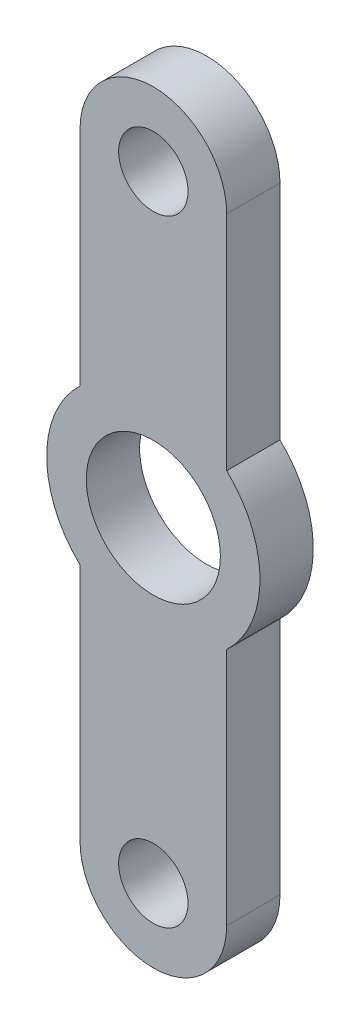
ISO-10303-21;
HEADER;
FILE_DESCRIPTION(('STEP AP214'),'2;1');
FILE_NAME('part.step','',(''),(''),'','','');
FILE_SCHEMA(('AUTOMOTIVE_DESIGN { 1 0 10303 214 1 1 1 1 }'));
ENDSEC;
DATA;
#1=APPLICATION_CONTEXT('core data for automotive mechanical design processes');
#2=APPLICATION_PROTOCOL_DEFINITION('international standard','automotive_design',2000,#1);
#3=PRODUCT_CONTEXT('',#1,'mechanical');
#4=PRODUCT('Part','Part','',(#3));
#5=PRODUCT_RELATED_PRODUCT_CATEGORY('part','',(#4));
#6=PRODUCT_DEFINITION_FORMATION('','',#4);
#7=PRODUCT_DEFINITION_CONTEXT('part definition',#1,'design');
#8=PRODUCT_DEFINITION('design','',#6,#7);
#9=PRODUCT_DEFINITION_SHAPE('','',#8);
#10=(LENGTH_UNIT() NAMED_UNIT(*) SI_UNIT(.MILLI.,.METRE.));
#11=(NAMED_UNIT(*) PLANE_ANGLE_UNIT() SI_UNIT($,.RADIAN.));
#12=(NAMED_UNIT(*) SI_UNIT($,.STERADIAN.) SOLID_ANGLE_UNIT());
#13=UNCERTAINTY_MEASURE_WITH_UNIT(LENGTH_MEASURE(1.E-05),#10,'distance_accuracy_value','');
#14=(GEOMETRIC_REPRESENTATION_CONTEXT(3) GLOBAL_UNCERTAINTY_ASSIGNED_CONTEXT((#13)) GLOBAL_UNIT_ASSIGNED_CONTEXT((#10,
#11,#12)) REPRESENTATION_CONTEXT('',''));
#15=CARTESIAN_POINT('',(0.,0.,0.));
#16=DIRECTION('',(0.,0.,1.));
#17=DIRECTION('',(1.,0.,0.));
#18=AXIS2_PLACEMENT_3D('',#15,#16,#17);
#19=CARTESIAN_POINT('',(0.,22.5,4.));
#20=DIRECTION('',(0.,0.,-1.));
#21=DIRECTION('',(-1.,0.,0.));
#22=AXIS2_PLACEMENT_3D('',#19,#20,#21);
#23=PLANE('',#22);
#24=CARTESIAN_POINT('',(0.,22.5,4.));
#25=DIRECTION('',(0.,0.,1.));
#26=DIRECTION('',(-1.,0.,0.));
#27=AXIS2_PLACEMENT_3D('',#24,#25,#26);
#28=CIRCLE('',#27,5.5);
#29=CARTESIAN_POINT('',(5.5,22.5,4.));
#30=VERTEX_POINT('',#29);
#31=CARTESIAN_POINT('',(-5.5,22.5,4.));
#32=VERTEX_POINT('',#31);
#33=EDGE_CURVE('E164',#30,#32,#28,.T.);
#34=ORIENTED_EDGE('',*,*,#33,.T.);
#35=DIRECTION('',(0.,-1.,0.));
#36=VECTOR('',#35,1.);
#37=CARTESIAN_POINT('',(-5.5,22.5,4.));
#38=LINE('',#37,#36);
#39=CARTESIAN_POINT('',(-5.5,5.80947501931113,4.));
#40=VERTEX_POINT('',#39);
#41=EDGE_CURVE('E100',#32,#40,#38,.T.);
#42=ORIENTED_EDGE('',*,*,#41,.T.);
#43=CARTESIAN_POINT('',(0.,0.,4.));
#44=DIRECTION('',(0.,0.,1.));
#45=DIRECTION('',(-1.,0.,0.));
#46=AXIS2_PLACEMENT_3D('',#43,#44,#45);
#47=CIRCLE('',#46,8.00000000000001);
#48=CARTESIAN_POINT('',(-5.5,-5.80947501931112,4.));
#49=VERTEX_POINT('',#48);
#50=EDGE_CURVE('E185',#40,#49,#47,.T.);
#51=ORIENTED_EDGE('',*,*,#50,.T.);
#52=DIRECTION('',(0.,-1.,0.));
#53=VECTOR('',#52,1.);
#54=CARTESIAN_POINT('',(-5.5,-23.75,4.));
#55=LINE('',#54,#53);
#56=CARTESIAN_POINT('',(-5.5,-23.75,4.));
#57=VERTEX_POINT('',#56);
#58=EDGE_CURVE('E199',#49,#57,#55,.T.);
#59=ORIENTED_EDGE('',*,*,#58,.T.);
#60=CARTESIAN_POINT('',(0.,-23.75,4.));
#61=DIRECTION('',(0.,0.,1.));
#62=DIRECTION('',(1.,0.,0.));
#63=AXIS2_PLACEMENT_3D('',#60,#61,#62);
#64=CIRCLE('',#63,5.5);
#65=CARTESIAN_POINT('',(5.5,-23.75,4.));
#66=VERTEX_POINT('',#65);
#67=EDGE_CURVE('E119',#57,#66,#64,.T.);
#68=ORIENTED_EDGE('',*,*,#67,.T.);
#69=DIRECTION('',(0.,1.,0.));
#70=VECTOR('',#69,1.);
#71=CARTESIAN_POINT('',(5.5,-23.75,4.));
#72=LINE('',#71,#70);
#73=CARTESIAN_POINT('',(5.5,-5.80947501931113,4.));
#74=VERTEX_POINT('',#73);
#75=EDGE_CURVE('E113',#66,#74,#72,.T.);
#76=ORIENTED_EDGE('',*,*,#75,.T.);
#77=CARTESIAN_POINT('',(0.,0.,4.));
#78=DIRECTION('',(0.,0.,1.));
#79=DIRECTION('',(-1.,0.,0.));
#80=AXIS2_PLACEMENT_3D('',#77,#78,#79);
#81=CIRCLE('',#80,8.);
#82=CARTESIAN_POINT('',(5.5,5.80947501931112,4.));
#83=VERTEX_POINT('',#82);
#84=EDGE_CURVE('E117',#74,#83,#81,.T.);
#85=ORIENTED_EDGE('',*,*,#84,.T.);
#86=DIRECTION('',(0.,1.,0.));
#87=VECTOR('',#86,1.);
#88=CARTESIAN_POINT('',(5.5,22.5,4.));
#89=LINE('',#88,#87);
#90=EDGE_CURVE('E57',#83,#30,#89,.T.);
#91=ORIENTED_EDGE('',*,*,#90,.T.);
#92=EDGE_LOOP('',(#34,#42,#51,#59,#68,#76,#85,#91));
#93=FACE_BOUND('',#92,.T.);
#94=CARTESIAN_POINT('',(0.,22.5,4.));
#95=DIRECTION('',(0.,0.,1.));
#96=DIRECTION('',(1.,0.,0.));
#97=AXIS2_PLACEMENT_3D('',#94,#95,#96);
#98=CIRCLE('',#97,2.6);
#99=CARTESIAN_POINT('',(2.6,22.5,4.));
#100=VERTEX_POINT('',#99);
#101=EDGE_CURVE('E146',#100,#100,#98,.T.);
#102=ORIENTED_EDGE('',*,*,#101,.F.);
#103=EDGE_LOOP('',(#102));
#104=FACE_BOUND('',#103,.T.);
#105=CARTESIAN_POINT('',(0.,-23.75,4.));
#106=DIRECTION('',(0.,0.,1.));
#107=DIRECTION('',(1.,0.,0.));
#108=AXIS2_PLACEMENT_3D('',#105,#106,#107);
#109=CIRCLE('',#108,2.6);
#110=CARTESIAN_POINT('',(2.6,-23.75,4.));
#111=VERTEX_POINT('',#110);
#112=EDGE_CURVE('E213',#111,#111,#109,.T.);
#113=ORIENTED_EDGE('',*,*,#112,.F.);
#114=EDGE_LOOP('',(#113));
#115=FACE_BOUND('',#114,.T.);
#116=CARTESIAN_POINT('',(0.,0.,4.));
#117=DIRECTION('',(0.,0.,1.));
#118=DIRECTION('',(1.,0.,0.));
#119=AXIS2_PLACEMENT_3D('',#116,#117,#118);
#120=CIRCLE('',#119,5.03);
#121=CARTESIAN_POINT('',(5.03,0.,4.));
#122=VERTEX_POINT('',#121);
#123=EDGE_CURVE('E221',#122,#122,#120,.T.);
#124=ORIENTED_EDGE('',*,*,#123,.F.);
#125=EDGE_LOOP('',(#124));
#126=FACE_BOUND('',#125,.T.);
#127=ADVANCED_FACE('F39',(#93,#104,#115,#126),#23,.F.);
#128=CARTESIAN_POINT('',(0.,22.5,0.));
#129=DIRECTION('',(0.,0.,-1.));
#130=DIRECTION('',(-1.,0.,0.));
#131=AXIS2_PLACEMENT_3D('',#128,#129,#130);
#132=PLANE('',#131);
#133=CARTESIAN_POINT('',(0.,-23.75,0.));
#134=DIRECTION('',(0.,0.,1.));
#135=DIRECTION('',(1.,0.,0.));
#136=AXIS2_PLACEMENT_3D('',#133,#134,#135);
#137=CIRCLE('',#136,2.6);
#138=CARTESIAN_POINT('',(2.6,-23.75,0.));
#139=VERTEX_POINT('',#138);
#140=EDGE_CURVE('E217',#139,#139,#137,.T.);
#141=ORIENTED_EDGE('',*,*,#140,.T.);
#142=EDGE_LOOP('',(#141));
#143=FACE_BOUND('',#142,.T.);
#144=CARTESIAN_POINT('',(0.,22.5,0.));
#145=DIRECTION('',(0.,0.,1.));
#146=DIRECTION('',(-1.,0.,0.));
#147=AXIS2_PLACEMENT_3D('',#144,#145,#146);
#148=CIRCLE('',#147,5.5);
#149=CARTESIAN_POINT('',(5.5,22.5,0.));
#150=VERTEX_POINT('',#149);
#151=CARTESIAN_POINT('',(-5.5,22.5,0.));
#152=VERTEX_POINT('',#151);
#153=EDGE_CURVE('E141',#150,#152,#148,.T.);
#154=ORIENTED_EDGE('',*,*,#153,.F.);
#155=DIRECTION('',(0.,1.,0.));
#156=VECTOR('',#155,1.);
#157=CARTESIAN_POINT('',(5.5,22.5,0.));
#158=LINE('',#157,#156);
#159=CARTESIAN_POINT('',(5.5,5.80947501931112,0.));
#160=VERTEX_POINT('',#159);
#161=EDGE_CURVE('E92',#160,#150,#158,.T.);
#162=ORIENTED_EDGE('',*,*,#161,.F.);
#163=CARTESIAN_POINT('',(0.,0.,0.));
#164=DIRECTION('',(0.,0.,1.));
#165=DIRECTION('',(-1.,0.,0.));
#166=AXIS2_PLACEMENT_3D('',#163,#164,#165);
#167=CIRCLE('',#166,8.);
#168=CARTESIAN_POINT('',(5.5,-5.80947501931113,0.));
#169=VERTEX_POINT('',#168);
#170=EDGE_CURVE('E86',#169,#160,#167,.T.);
#171=ORIENTED_EDGE('',*,*,#170,.F.);
#172=DIRECTION('',(0.,1.,0.));
#173=VECTOR('',#172,1.);
#174=CARTESIAN_POINT('',(5.5,-23.75,0.));
#175=LINE('',#174,#173);
#176=CARTESIAN_POINT('',(5.5,-23.75,0.));
#177=VERTEX_POINT('',#176);
#178=EDGE_CURVE('E128',#177,#169,#175,.T.);
#179=ORIENTED_EDGE('',*,*,#178,.F.);
#180=CARTESIAN_POINT('',(0.,-23.75,0.));
#181=DIRECTION('',(0.,0.,1.));
#182=DIRECTION('',(1.,0.,0.));
#183=AXIS2_PLACEMENT_3D('',#180,#181,#182);
#184=CIRCLE('',#183,5.5);
#185=CARTESIAN_POINT('',(-5.5,-23.75,0.));
#186=VERTEX_POINT('',#185);
#187=EDGE_CURVE('E155',#186,#177,#184,.T.);
#188=ORIENTED_EDGE('',*,*,#187,.F.);
#189=DIRECTION('',(0.,-1.,0.));
#190=VECTOR('',#189,1.);
#191=CARTESIAN_POINT('',(-5.5,-23.75,0.));
#192=LINE('',#191,#190);
#193=CARTESIAN_POINT('',(-5.5,-5.80947501931112,0.));
#194=VERTEX_POINT('',#193);
#195=EDGE_CURVE('E152',#194,#186,#192,.T.);
#196=ORIENTED_EDGE('',*,*,#195,.F.);
#197=CARTESIAN_POINT('',(0.,0.,0.));
#198=DIRECTION('',(0.,0.,1.));
#199=DIRECTION('',(-1.,0.,0.));
#200=AXIS2_PLACEMENT_3D('',#197,#198,#199);
#201=CIRCLE('',#200,8.00000000000001);
#202=CARTESIAN_POINT('',(-5.5,5.80947501931113,0.));
#203=VERTEX_POINT('',#202);
#204=EDGE_CURVE('E149',#203,#194,#201,.T.);
#205=ORIENTED_EDGE('',*,*,#204,.F.);
#206=DIRECTION('',(0.,-1.,0.));
#207=VECTOR('',#206,1.);
#208=CARTESIAN_POINT('',(-5.5,22.5,0.));
#209=LINE('',#208,#207);
#210=EDGE_CURVE('E145',#152,#203,#209,.T.);
#211=ORIENTED_EDGE('',*,*,#210,.F.);
#212=EDGE_LOOP('',(#154,#162,#171,#179,#188,#196,#205,#211));
#213=FACE_BOUND('',#212,.T.);
#214=CARTESIAN_POINT('',(0.,22.5,0.));
#215=DIRECTION('',(0.,0.,1.));
#216=DIRECTION('',(1.,0.,0.));
#217=AXIS2_PLACEMENT_3D('',#214,#215,#216);
#218=CIRCLE('',#217,2.6);
#219=CARTESIAN_POINT('',(2.6,22.5,0.));
#220=VERTEX_POINT('',#219);
#221=EDGE_CURVE('E209',#220,#220,#218,.T.);
#222=ORIENTED_EDGE('',*,*,#221,.T.);
#223=EDGE_LOOP('',(#222));
#224=FACE_BOUND('',#223,.T.);
#225=CARTESIAN_POINT('',(0.,0.,0.));
#226=DIRECTION('',(0.,0.,1.));
#227=DIRECTION('',(1.,0.,0.));
#228=AXIS2_PLACEMENT_3D('',#225,#226,#227);
#229=CIRCLE('',#228,5.03);
#230=CARTESIAN_POINT('',(5.03,0.,0.));
#231=VERTEX_POINT('',#230);
#232=EDGE_CURVE('E225',#231,#231,#229,.T.);
#233=ORIENTED_EDGE('',*,*,#232,.T.);
#234=EDGE_LOOP('',(#233));
#235=FACE_BOUND('',#234,.T.);
#236=ADVANCED_FACE('F189',(#143,#213,#224,#235),#132,.T.);
#237=CARTESIAN_POINT('',(0.,22.5,4.));
#238=DIRECTION('',(0.,0.,-1.));
#239=DIRECTION('',(-1.,0.,0.));
#240=AXIS2_PLACEMENT_3D('',#237,#238,#239);
#241=CYLINDRICAL_SURFACE('',#240,5.5);
#242=ORIENTED_EDGE('',*,*,#153,.T.);
#243=DIRECTION('',(0.,0.,-1.));
#244=VECTOR('',#243,1.);
#245=CARTESIAN_POINT('',(-5.5,22.5,4.));
#246=LINE('',#245,#244);
#247=EDGE_CURVE('E11',#32,#152,#246,.T.);
#248=ORIENTED_EDGE('',*,*,#247,.F.);
#249=ORIENTED_EDGE('',*,*,#33,.F.);
#250=DIRECTION('',(0.,0.,-1.));
#251=VECTOR('',#250,1.);
#252=CARTESIAN_POINT('',(5.5,22.5,4.));
#253=LINE('',#252,#251);
#254=EDGE_CURVE('E137',#30,#150,#253,.T.);
#255=ORIENTED_EDGE('',*,*,#254,.T.);
#256=EDGE_LOOP('',(#242,#248,#249,#255));
#257=FACE_BOUND('',#256,.T.);
#258=ADVANCED_FACE('F41',(#257),#241,.T.);
#259=CARTESIAN_POINT('',(-5.5,22.5,4.));
#260=DIRECTION('',(1.,0.,0.));
#261=DIRECTION('',(0.,0.,-1.));
#262=AXIS2_PLACEMENT_3D('',#259,#260,#261);
#263=PLANE('',#262);
#264=ORIENTED_EDGE('',*,*,#210,.T.);
#265=DIRECTION('',(0.,0.,-1.));
#266=VECTOR('',#265,1.);
#267=CARTESIAN_POINT('',(-5.5,5.80947501931113,4.));
#268=LINE('',#267,#266);
#269=EDGE_CURVE('E49',#40,#203,#268,.T.);
#270=ORIENTED_EDGE('',*,*,#269,.F.);
#271=ORIENTED_EDGE('',*,*,#41,.F.);
#272=ORIENTED_EDGE('',*,*,#247,.T.);
#273=EDGE_LOOP('',(#264,#270,#271,#272));
#274=FACE_BOUND('',#273,.T.);
#275=ADVANCED_FACE('F259',(#274),#263,.F.);
#276=CARTESIAN_POINT('',(0.,0.,4.));
#277=DIRECTION('',(0.,0.,-1.));
#278=DIRECTION('',(-1.,0.,0.));
#279=AXIS2_PLACEMENT_3D('',#276,#277,#278);
#280=CYLINDRICAL_SURFACE('',#279,8.00000000000001);
#281=ORIENTED_EDGE('',*,*,#204,.T.);
#282=DIRECTION('',(0.,0.,-1.));
#283=VECTOR('',#282,1.);
#284=CARTESIAN_POINT('',(-5.5,-5.80947501931112,4.));
#285=LINE('',#284,#283);
#286=EDGE_CURVE('E175',#49,#194,#285,.T.);
#287=ORIENTED_EDGE('',*,*,#286,.F.);
#288=ORIENTED_EDGE('',*,*,#50,.F.);
#289=ORIENTED_EDGE('',*,*,#269,.T.);
#290=EDGE_LOOP('',(#281,#287,#288,#289));
#291=FACE_BOUND('',#290,.T.);
#292=ADVANCED_FACE('F183',(#291),#280,.T.);
#293=CARTESIAN_POINT('',(-5.5,-23.75,4.));
#294=DIRECTION('',(1.,0.,0.));
#295=DIRECTION('',(0.,0.,-1.));
#296=AXIS2_PLACEMENT_3D('',#293,#294,#295);
#297=PLANE('',#296);
#298=ORIENTED_EDGE('',*,*,#195,.T.);
#299=DIRECTION('',(0.,0.,-1.));
#300=VECTOR('',#299,1.);
#301=CARTESIAN_POINT('',(-5.5,-23.75,4.));
#302=LINE('',#301,#300);
#303=EDGE_CURVE('E171',#57,#186,#302,.T.);
#304=ORIENTED_EDGE('',*,*,#303,.F.);
#305=ORIENTED_EDGE('',*,*,#58,.F.);
#306=ORIENTED_EDGE('',*,*,#286,.T.);
#307=EDGE_LOOP('',(#298,#304,#305,#306));
#308=FACE_BOUND('',#307,.T.);
#309=ADVANCED_FACE('F194',(#308),#297,.F.);
#310=CARTESIAN_POINT('',(0.,-23.75,4.));
#311=DIRECTION('',(0.,0.,-1.));
#312=DIRECTION('',(-1.,0.,0.));
#313=AXIS2_PLACEMENT_3D('',#310,#311,#312);
#314=CYLINDRICAL_SURFACE('',#313,5.5);
#315=ORIENTED_EDGE('',*,*,#187,.T.);
#316=DIRECTION('',(0.,0.,-1.));
#317=VECTOR('',#316,1.);
#318=CARTESIAN_POINT('',(5.5,-23.75,4.));
#319=LINE('',#318,#317);
#320=EDGE_CURVE('E130',#66,#177,#319,.T.);
#321=ORIENTED_EDGE('',*,*,#320,.F.);
#322=ORIENTED_EDGE('',*,*,#67,.F.);
#323=ORIENTED_EDGE('',*,*,#303,.T.);
#324=EDGE_LOOP('',(#315,#321,#322,#323));
#325=FACE_BOUND('',#324,.T.);
#326=ADVANCED_FACE('F197',(#325),#314,.T.);
#327=CARTESIAN_POINT('',(5.5,-23.75,4.));
#328=DIRECTION('',(-1.,0.,0.));
#329=DIRECTION('',(0.,0.,1.));
#330=AXIS2_PLACEMENT_3D('',#327,#328,#329);
#331=PLANE('',#330);
#332=ORIENTED_EDGE('',*,*,#178,.T.);
#333=DIRECTION('',(0.,0.,-1.));
#334=VECTOR('',#333,1.);
#335=CARTESIAN_POINT('',(5.5,-5.80947501931113,4.));
#336=LINE('',#335,#334);
#337=EDGE_CURVE('E125',#74,#169,#336,.T.);
#338=ORIENTED_EDGE('',*,*,#337,.F.);
#339=ORIENTED_EDGE('',*,*,#75,.F.);
#340=ORIENTED_EDGE('',*,*,#320,.T.);
#341=EDGE_LOOP('',(#332,#338,#339,#340));
#342=FACE_BOUND('',#341,.T.);
#343=ADVANCED_FACE('F126',(#342),#331,.F.);
#344=CARTESIAN_POINT('',(0.,0.,4.));
#345=DIRECTION('',(0.,0.,-1.));
#346=DIRECTION('',(-1.,0.,0.));
#347=AXIS2_PLACEMENT_3D('',#344,#345,#346);
#348=CYLINDRICAL_SURFACE('',#347,8.);
#349=ORIENTED_EDGE('',*,*,#170,.T.);
#350=DIRECTION('',(0.,0.,-1.));
#351=VECTOR('',#350,1.);
#352=CARTESIAN_POINT('',(5.5,5.80947501931112,4.));
#353=LINE('',#352,#351);
#354=EDGE_CURVE('E131',#83,#160,#353,.T.);
#355=ORIENTED_EDGE('',*,*,#354,.F.);
#356=ORIENTED_EDGE('',*,*,#84,.F.);
#357=ORIENTED_EDGE('',*,*,#337,.T.);
#358=EDGE_LOOP('',(#349,#355,#356,#357));
#359=FACE_BOUND('',#358,.T.);
#360=ADVANCED_FACE('F133',(#359),#348,.T.);
#361=CARTESIAN_POINT('',(5.5,22.5,4.));
#362=DIRECTION('',(-1.,0.,0.));
#363=DIRECTION('',(0.,0.,1.));
#364=AXIS2_PLACEMENT_3D('',#361,#362,#363);
#365=PLANE('',#364);
#366=ORIENTED_EDGE('',*,*,#161,.T.);
#367=ORIENTED_EDGE('',*,*,#254,.F.);
#368=ORIENTED_EDGE('',*,*,#90,.F.);
#369=ORIENTED_EDGE('',*,*,#354,.T.);
#370=EDGE_LOOP('',(#366,#367,#368,#369));
#371=FACE_BOUND('',#370,.T.);
#372=ADVANCED_FACE('F247',(#371),#365,.F.);
#373=CARTESIAN_POINT('',(0.,22.5,4.));
#374=DIRECTION('',(0.,0.,-1.));
#375=DIRECTION('',(-1.,0.,0.));
#376=AXIS2_PLACEMENT_3D('',#373,#374,#375);
#377=CYLINDRICAL_SURFACE('',#376,2.6);
#378=ORIENTED_EDGE('',*,*,#101,.T.);
#379=EDGE_LOOP('',(#378));
#380=FACE_BOUND('',#379,.T.);
#381=ORIENTED_EDGE('',*,*,#221,.F.);
#382=EDGE_LOOP('',(#381));
#383=FACE_BOUND('',#382,.T.);
#384=ADVANCED_FACE('F244',(#380,#383),#377,.F.);
#385=CARTESIAN_POINT('',(0.,-23.75,4.));
#386=DIRECTION('',(0.,0.,-1.));
#387=DIRECTION('',(-1.,0.,0.));
#388=AXIS2_PLACEMENT_3D('',#385,#386,#387);
#389=CYLINDRICAL_SURFACE('',#388,2.6);
#390=ORIENTED_EDGE('',*,*,#112,.T.);
#391=EDGE_LOOP('',(#390));
#392=FACE_BOUND('',#391,.T.);
#393=ORIENTED_EDGE('',*,*,#140,.F.);
#394=EDGE_LOOP('',(#393));
#395=FACE_BOUND('',#394,.T.);
#396=ADVANCED_FACE('F323',(#392,#395),#389,.F.);
#397=CARTESIAN_POINT('',(0.,0.,4.));
#398=DIRECTION('',(0.,0.,-1.));
#399=DIRECTION('',(-1.,0.,0.));
#400=AXIS2_PLACEMENT_3D('',#397,#398,#399);
#401=CYLINDRICAL_SURFACE('',#400,5.03);
#402=ORIENTED_EDGE('',*,*,#123,.T.);
#403=EDGE_LOOP('',(#402));
#404=FACE_BOUND('',#403,.T.);
#405=ORIENTED_EDGE('',*,*,#232,.F.);
#406=EDGE_LOOP('',(#405));
#407=FACE_BOUND('',#406,.T.);
#408=ADVANCED_FACE('F233',(#404,#407),#401,.F.);
#409=CLOSED_SHELL('',(#127,#236,#258,#275,#292,#309,#326,#343,#360,#372,#384,#396,#408));
#410=MANIFOLD_SOLID_BREP('B2',#409);
#411=ADVANCED_BREP_SHAPE_REPRESENTATION('',(#18,#410),#14);
#412=SHAPE_DEFINITION_REPRESENTATION(#9,#411);
ENDSEC;
END-ISO-10303-21;
